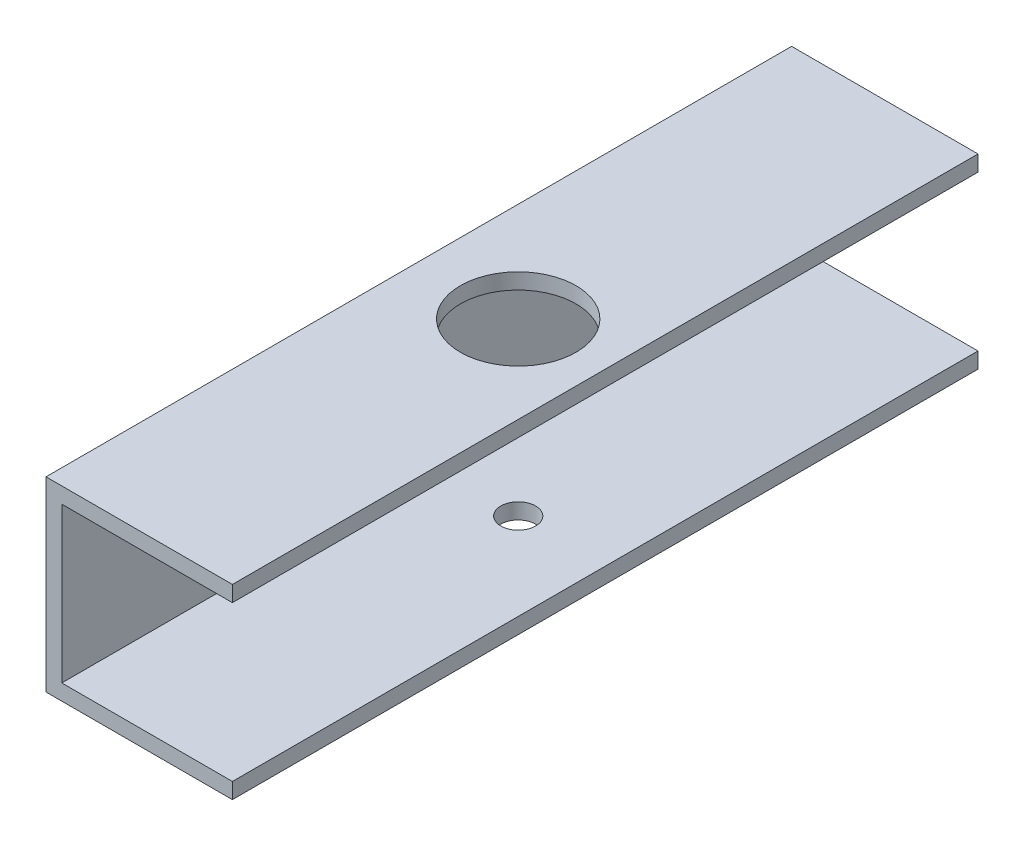
ISO-10303-21;
HEADER;
FILE_DESCRIPTION(('STEP AP214'),'2;1');
FILE_NAME('part.step','',(''),(''),'','','');
FILE_SCHEMA(('AUTOMOTIVE_DESIGN { 1 0 10303 214 1 1 1 1 }'));
ENDSEC;
DATA;
#1=APPLICATION_CONTEXT('core data for automotive mechanical design processes');
#2=APPLICATION_PROTOCOL_DEFINITION('international standard','automotive_design',2000,#1);
#3=PRODUCT_CONTEXT('',#1,'mechanical');
#4=PRODUCT('Part','Part','',(#3));
#5=PRODUCT_RELATED_PRODUCT_CATEGORY('part','',(#4));
#6=PRODUCT_DEFINITION_FORMATION('','',#4);
#7=PRODUCT_DEFINITION_CONTEXT('part definition',#1,'design');
#8=PRODUCT_DEFINITION('design','',#6,#7);
#9=PRODUCT_DEFINITION_SHAPE('','',#8);
#10=(LENGTH_UNIT() NAMED_UNIT(*) SI_UNIT(.MILLI.,.METRE.));
#11=(NAMED_UNIT(*) PLANE_ANGLE_UNIT() SI_UNIT($,.RADIAN.));
#12=(NAMED_UNIT(*) SI_UNIT($,.STERADIAN.) SOLID_ANGLE_UNIT());
#13=UNCERTAINTY_MEASURE_WITH_UNIT(LENGTH_MEASURE(1.E-05),#10,'distance_accuracy_value','');
#14=(GEOMETRIC_REPRESENTATION_CONTEXT(3) GLOBAL_UNCERTAINTY_ASSIGNED_CONTEXT((#13)) GLOBAL_UNIT_ASSIGNED_CONTEXT((#10,
#11,#12)) REPRESENTATION_CONTEXT('',''));
#15=CARTESIAN_POINT('',(0.,0.,0.));
#16=DIRECTION('',(0.,0.,1.));
#17=DIRECTION('',(1.,0.,0.));
#18=AXIS2_PLACEMENT_3D('',#15,#16,#17);
#19=CARTESIAN_POINT('',(75.,-37.5,300.));
#20=DIRECTION('',(0.,1.,0.));
#21=DIRECTION('',(0.,0.,1.));
#22=AXIS2_PLACEMENT_3D('',#19,#20,#21);
#23=PLANE('',#22);
#24=CARTESIAN_POINT('',(40.,-37.5,150.));
#25=DIRECTION('',(0.,-1.,0.));
#26=DIRECTION('',(0.,0.,-1.));
#27=AXIS2_PLACEMENT_3D('',#24,#25,#26);
#28=CIRCLE('',#27,7.);
#29=CARTESIAN_POINT('',(40.,-37.5,143.));
#30=VERTEX_POINT('',#29);
#31=EDGE_CURVE('E186',#30,#30,#28,.T.);
#32=ORIENTED_EDGE('',*,*,#31,.F.);
#33=EDGE_LOOP('',(#32));
#34=FACE_BOUND('',#33,.T.);
#35=DIRECTION('',(1.,0.,0.));
#36=VECTOR('',#35,1.);
#37=CARTESIAN_POINT('',(75.,-37.5,0.));
#38=LINE('',#37,#36);
#39=CARTESIAN_POINT('',(0.,-37.5,0.));
#40=VERTEX_POINT('',#39);
#41=CARTESIAN_POINT('',(75.,-37.5,0.));
#42=VERTEX_POINT('',#41);
#43=EDGE_CURVE('E132',#40,#42,#38,.T.);
#44=ORIENTED_EDGE('',*,*,#43,.T.);
#45=DIRECTION('',(0.,0.,-1.));
#46=VECTOR('',#45,1.);
#47=CARTESIAN_POINT('',(75.,-37.5,300.));
#48=LINE('',#47,#46);
#49=CARTESIAN_POINT('',(75.,-37.5,300.));
#50=VERTEX_POINT('',#49);
#51=EDGE_CURVE('E11',#50,#42,#48,.T.);
#52=ORIENTED_EDGE('',*,*,#51,.F.);
#53=DIRECTION('',(1.,0.,0.));
#54=VECTOR('',#53,1.);
#55=CARTESIAN_POINT('',(75.,-37.5,300.));
#56=LINE('',#55,#54);
#57=CARTESIAN_POINT('',(0.,-37.5,300.));
#58=VERTEX_POINT('',#57);
#59=EDGE_CURVE('E147',#58,#50,#56,.T.);
#60=ORIENTED_EDGE('',*,*,#59,.F.);
#61=DIRECTION('',(0.,0.,-1.));
#62=VECTOR('',#61,1.);
#63=CARTESIAN_POINT('',(0.,-37.5,300.));
#64=LINE('',#63,#62);
#65=EDGE_CURVE('E128',#58,#40,#64,.T.);
#66=ORIENTED_EDGE('',*,*,#65,.T.);
#67=EDGE_LOOP('',(#44,#52,#60,#66));
#68=FACE_BOUND('',#67,.T.);
#69=ADVANCED_FACE('F35',(#34,#68),#23,.F.);
#70=CARTESIAN_POINT('',(75.,-31.15,300.));
#71=DIRECTION('',(-1.,0.,0.));
#72=DIRECTION('',(0.,-1.,0.));
#73=AXIS2_PLACEMENT_3D('',#70,#71,#72);
#74=PLANE('',#73);
#75=DIRECTION('',(0.,1.,0.));
#76=VECTOR('',#75,1.);
#77=CARTESIAN_POINT('',(75.,-31.15,0.));
#78=LINE('',#77,#76);
#79=CARTESIAN_POINT('',(75.,-31.15,0.));
#80=VERTEX_POINT('',#79);
#81=EDGE_CURVE('E135',#42,#80,#78,.T.);
#82=ORIENTED_EDGE('',*,*,#81,.T.);
#83=DIRECTION('',(0.,0.,-1.));
#84=VECTOR('',#83,1.);
#85=CARTESIAN_POINT('',(75.,-31.15,300.));
#86=LINE('',#85,#84);
#87=CARTESIAN_POINT('',(75.,-31.15,300.));
#88=VERTEX_POINT('',#87);
#89=EDGE_CURVE('E44',#88,#80,#86,.T.);
#90=ORIENTED_EDGE('',*,*,#89,.F.);
#91=DIRECTION('',(0.,1.,0.));
#92=VECTOR('',#91,1.);
#93=CARTESIAN_POINT('',(75.,-31.15,300.));
#94=LINE('',#93,#92);
#95=EDGE_CURVE('E95',#50,#88,#94,.T.);
#96=ORIENTED_EDGE('',*,*,#95,.F.);
#97=ORIENTED_EDGE('',*,*,#51,.T.);
#98=EDGE_LOOP('',(#82,#90,#96,#97));
#99=FACE_BOUND('',#98,.T.);
#100=ADVANCED_FACE('F204',(#99),#74,.F.);
#101=CARTESIAN_POINT('',(6.35000000000001,-31.15,300.));
#102=DIRECTION('',(0.,-1.,0.));
#103=DIRECTION('',(0.,0.,-1.));
#104=AXIS2_PLACEMENT_3D('',#101,#102,#103);
#105=PLANE('',#104);
#106=CARTESIAN_POINT('',(40.,-31.15,150.));
#107=DIRECTION('',(0.,-1.,0.));
#108=DIRECTION('',(0.,0.,-1.));
#109=AXIS2_PLACEMENT_3D('',#106,#107,#108);
#110=CIRCLE('',#109,7.);
#111=CARTESIAN_POINT('',(40.,-31.15,143.));
#112=VERTEX_POINT('',#111);
#113=EDGE_CURVE('E38',#112,#112,#110,.T.);
#114=ORIENTED_EDGE('',*,*,#113,.T.);
#115=EDGE_LOOP('',(#114));
#116=FACE_BOUND('',#115,.T.);
#117=DIRECTION('',(-1.,0.,0.));
#118=VECTOR('',#117,1.);
#119=CARTESIAN_POINT('',(6.35000000000001,-31.15,0.));
#120=LINE('',#119,#118);
#121=CARTESIAN_POINT('',(6.35000000000001,-31.15,0.));
#122=VERTEX_POINT('',#121);
#123=EDGE_CURVE('E138',#80,#122,#120,.T.);
#124=ORIENTED_EDGE('',*,*,#123,.T.);
#125=DIRECTION('',(0.,0.,-1.));
#126=VECTOR('',#125,1.);
#127=CARTESIAN_POINT('',(6.35000000000001,-31.15,300.));
#128=LINE('',#127,#126);
#129=CARTESIAN_POINT('',(6.35000000000001,-31.15,300.));
#130=VERTEX_POINT('',#129);
#131=EDGE_CURVE('E154',#130,#122,#128,.T.);
#132=ORIENTED_EDGE('',*,*,#131,.F.);
#133=DIRECTION('',(-1.,0.,0.));
#134=VECTOR('',#133,1.);
#135=CARTESIAN_POINT('',(6.35000000000001,-31.15,300.));
#136=LINE('',#135,#134);
#137=EDGE_CURVE('E163',#88,#130,#136,.T.);
#138=ORIENTED_EDGE('',*,*,#137,.F.);
#139=ORIENTED_EDGE('',*,*,#89,.T.);
#140=EDGE_LOOP('',(#124,#132,#138,#139));
#141=FACE_BOUND('',#140,.T.);
#142=ADVANCED_FACE('F161',(#116,#141),#105,.F.);
#143=CARTESIAN_POINT('',(6.35000000000001,31.15,300.));
#144=DIRECTION('',(-1.,0.,0.));
#145=DIRECTION('',(0.,0.,1.));
#146=AXIS2_PLACEMENT_3D('',#143,#144,#145);
#147=PLANE('',#146);
#148=DIRECTION('',(0.,1.,0.));
#149=VECTOR('',#148,1.);
#150=CARTESIAN_POINT('',(6.35000000000001,31.15,0.));
#151=LINE('',#150,#149);
#152=CARTESIAN_POINT('',(6.35000000000001,31.15,0.));
#153=VERTEX_POINT('',#152);
#154=EDGE_CURVE('E140',#122,#153,#151,.T.);
#155=ORIENTED_EDGE('',*,*,#154,.T.);
#156=DIRECTION('',(0.,0.,-1.));
#157=VECTOR('',#156,1.);
#158=CARTESIAN_POINT('',(6.35000000000001,31.15,300.));
#159=LINE('',#158,#157);
#160=CARTESIAN_POINT('',(6.35000000000001,31.15,300.));
#161=VERTEX_POINT('',#160);
#162=EDGE_CURVE('E151',#161,#153,#159,.T.);
#163=ORIENTED_EDGE('',*,*,#162,.F.);
#164=DIRECTION('',(0.,1.,0.));
#165=VECTOR('',#164,1.);
#166=CARTESIAN_POINT('',(6.35000000000001,31.15,300.));
#167=LINE('',#166,#165);
#168=EDGE_CURVE('E175',#130,#161,#167,.T.);
#169=ORIENTED_EDGE('',*,*,#168,.F.);
#170=ORIENTED_EDGE('',*,*,#131,.T.);
#171=EDGE_LOOP('',(#155,#163,#169,#170));
#172=FACE_BOUND('',#171,.T.);
#173=ADVANCED_FACE('F171',(#172),#147,.F.);
#174=CARTESIAN_POINT('',(75.,31.15,300.));
#175=DIRECTION('',(0.,1.,0.));
#176=DIRECTION('',(0.,0.,1.));
#177=AXIS2_PLACEMENT_3D('',#174,#175,#176);
#178=PLANE('',#177);
#179=CARTESIAN_POINT('',(40.,31.15,150.));
#180=DIRECTION('',(0.,1.,0.));
#181=DIRECTION('',(0.,0.,1.));
#182=AXIS2_PLACEMENT_3D('',#179,#180,#181);
#183=CIRCLE('',#182,23.25);
#184=CARTESIAN_POINT('',(40.,31.15,173.25));
#185=VERTEX_POINT('',#184);
#186=EDGE_CURVE('E136',#185,#185,#183,.T.);
#187=ORIENTED_EDGE('',*,*,#186,.T.);
#188=EDGE_LOOP('',(#187));
#189=FACE_BOUND('',#188,.T.);
#190=DIRECTION('',(1.,0.,0.));
#191=VECTOR('',#190,1.);
#192=CARTESIAN_POINT('',(75.,31.15,0.));
#193=LINE('',#192,#191);
#194=CARTESIAN_POINT('',(75.,31.15,0.));
#195=VERTEX_POINT('',#194);
#196=EDGE_CURVE('E142',#153,#195,#193,.T.);
#197=ORIENTED_EDGE('',*,*,#196,.T.);
#198=DIRECTION('',(0.,0.,-1.));
#199=VECTOR('',#198,1.);
#200=CARTESIAN_POINT('',(75.,31.15,300.));
#201=LINE('',#200,#199);
#202=CARTESIAN_POINT('',(75.,31.15,300.));
#203=VERTEX_POINT('',#202);
#204=EDGE_CURVE('E123',#203,#195,#201,.T.);
#205=ORIENTED_EDGE('',*,*,#204,.F.);
#206=DIRECTION('',(1.,0.,0.));
#207=VECTOR('',#206,1.);
#208=CARTESIAN_POINT('',(75.,31.15,300.));
#209=LINE('',#208,#207);
#210=EDGE_CURVE('E114',#161,#203,#209,.T.);
#211=ORIENTED_EDGE('',*,*,#210,.F.);
#212=ORIENTED_EDGE('',*,*,#162,.T.);
#213=EDGE_LOOP('',(#197,#205,#211,#212));
#214=FACE_BOUND('',#213,.T.);
#215=ADVANCED_FACE('F174',(#189,#214),#178,.F.);
#216=CARTESIAN_POINT('',(75.,37.5,300.));
#217=DIRECTION('',(-1.,0.,0.));
#218=DIRECTION('',(0.,-1.,0.));
#219=AXIS2_PLACEMENT_3D('',#216,#217,#218);
#220=PLANE('',#219);
#221=DIRECTION('',(0.,1.,0.));
#222=VECTOR('',#221,1.);
#223=CARTESIAN_POINT('',(75.,37.5,0.));
#224=LINE('',#223,#222);
#225=CARTESIAN_POINT('',(75.,37.5,0.));
#226=VERTEX_POINT('',#225);
#227=EDGE_CURVE('E122',#195,#226,#224,.T.);
#228=ORIENTED_EDGE('',*,*,#227,.T.);
#229=DIRECTION('',(0.,0.,-1.));
#230=VECTOR('',#229,1.);
#231=CARTESIAN_POINT('',(75.,37.5,300.));
#232=LINE('',#231,#230);
#233=CARTESIAN_POINT('',(75.,37.5,300.));
#234=VERTEX_POINT('',#233);
#235=EDGE_CURVE('E119',#234,#226,#232,.T.);
#236=ORIENTED_EDGE('',*,*,#235,.F.);
#237=DIRECTION('',(0.,1.,0.));
#238=VECTOR('',#237,1.);
#239=CARTESIAN_POINT('',(75.,37.5,300.));
#240=LINE('',#239,#238);
#241=EDGE_CURVE('E108',#203,#234,#240,.T.);
#242=ORIENTED_EDGE('',*,*,#241,.F.);
#243=ORIENTED_EDGE('',*,*,#204,.T.);
#244=EDGE_LOOP('',(#228,#236,#242,#243));
#245=FACE_BOUND('',#244,.T.);
#246=ADVANCED_FACE('F120',(#245),#220,.F.);
#247=CARTESIAN_POINT('',(0.,37.5,300.));
#248=DIRECTION('',(0.,-1.,0.));
#249=DIRECTION('',(0.,0.,-1.));
#250=AXIS2_PLACEMENT_3D('',#247,#248,#249);
#251=PLANE('',#250);
#252=CARTESIAN_POINT('',(40.,37.5,150.));
#253=DIRECTION('',(0.,1.,0.));
#254=DIRECTION('',(0.,0.,1.));
#255=AXIS2_PLACEMENT_3D('',#252,#253,#254);
#256=CIRCLE('',#255,23.25);
#257=CARTESIAN_POINT('',(40.,37.5,173.25));
#258=VERTEX_POINT('',#257);
#259=EDGE_CURVE('E183',#258,#258,#256,.T.);
#260=ORIENTED_EDGE('',*,*,#259,.F.);
#261=EDGE_LOOP('',(#260));
#262=FACE_BOUND('',#261,.T.);
#263=DIRECTION('',(-1.,0.,0.));
#264=VECTOR('',#263,1.);
#265=CARTESIAN_POINT('',(0.,37.5,0.));
#266=LINE('',#265,#264);
#267=CARTESIAN_POINT('',(0.,37.5,0.));
#268=VERTEX_POINT('',#267);
#269=EDGE_CURVE('E81',#226,#268,#266,.T.);
#270=ORIENTED_EDGE('',*,*,#269,.T.);
#271=DIRECTION('',(0.,0.,-1.));
#272=VECTOR('',#271,1.);
#273=CARTESIAN_POINT('',(0.,37.5,300.));
#274=LINE('',#273,#272);
#275=CARTESIAN_POINT('',(0.,37.5,300.));
#276=VERTEX_POINT('',#275);
#277=EDGE_CURVE('E124',#276,#268,#274,.T.);
#278=ORIENTED_EDGE('',*,*,#277,.F.);
#279=DIRECTION('',(-1.,0.,0.));
#280=VECTOR('',#279,1.);
#281=CARTESIAN_POINT('',(0.,37.5,300.));
#282=LINE('',#281,#280);
#283=EDGE_CURVE('E112',#234,#276,#282,.T.);
#284=ORIENTED_EDGE('',*,*,#283,.F.);
#285=ORIENTED_EDGE('',*,*,#235,.T.);
#286=EDGE_LOOP('',(#270,#278,#284,#285));
#287=FACE_BOUND('',#286,.T.);
#288=ADVANCED_FACE('F126',(#262,#287),#251,.F.);
#289=CARTESIAN_POINT('',(0.,-37.5,300.));
#290=DIRECTION('',(1.,0.,0.));
#291=DIRECTION('',(0.,0.,-1.));
#292=AXIS2_PLACEMENT_3D('',#289,#290,#291);
#293=PLANE('',#292);
#294=DIRECTION('',(0.,-1.,0.));
#295=VECTOR('',#294,1.);
#296=CARTESIAN_POINT('',(0.,-37.5,0.));
#297=LINE('',#296,#295);
#298=EDGE_CURVE('E87',#268,#40,#297,.T.);
#299=ORIENTED_EDGE('',*,*,#298,.T.);
#300=ORIENTED_EDGE('',*,*,#65,.F.);
#301=DIRECTION('',(0.,-1.,0.));
#302=VECTOR('',#301,1.);
#303=CARTESIAN_POINT('',(0.,-37.5,300.));
#304=LINE('',#303,#302);
#305=EDGE_CURVE('E52',#276,#58,#304,.T.);
#306=ORIENTED_EDGE('',*,*,#305,.F.);
#307=ORIENTED_EDGE('',*,*,#277,.T.);
#308=EDGE_LOOP('',(#299,#300,#306,#307));
#309=FACE_BOUND('',#308,.T.);
#310=ADVANCED_FACE('F214',(#309),#293,.F.);
#311=CARTESIAN_POINT('',(0.,0.,300.));
#312=DIRECTION('',(0.,0.,-1.));
#313=DIRECTION('',(-1.,0.,0.));
#314=AXIS2_PLACEMENT_3D('',#311,#312,#313);
#315=PLANE('',#314);
#316=ORIENTED_EDGE('',*,*,#59,.T.);
#317=ORIENTED_EDGE('',*,*,#95,.T.);
#318=ORIENTED_EDGE('',*,*,#137,.T.);
#319=ORIENTED_EDGE('',*,*,#168,.T.);
#320=ORIENTED_EDGE('',*,*,#210,.T.);
#321=ORIENTED_EDGE('',*,*,#241,.T.);
#322=ORIENTED_EDGE('',*,*,#283,.T.);
#323=ORIENTED_EDGE('',*,*,#305,.T.);
#324=EDGE_LOOP('',(#316,#317,#318,#319,#320,#321,#322,#323));
#325=FACE_BOUND('',#324,.T.);
#326=ADVANCED_FACE('F110',(#325),#315,.F.);
#327=CARTESIAN_POINT('',(0.,0.,0.));
#328=DIRECTION('',(0.,0.,-1.));
#329=DIRECTION('',(-1.,0.,0.));
#330=AXIS2_PLACEMENT_3D('',#327,#328,#329);
#331=PLANE('',#330);
#332=ORIENTED_EDGE('',*,*,#43,.F.);
#333=ORIENTED_EDGE('',*,*,#298,.F.);
#334=ORIENTED_EDGE('',*,*,#269,.F.);
#335=ORIENTED_EDGE('',*,*,#227,.F.);
#336=ORIENTED_EDGE('',*,*,#196,.F.);
#337=ORIENTED_EDGE('',*,*,#154,.F.);
#338=ORIENTED_EDGE('',*,*,#123,.F.);
#339=ORIENTED_EDGE('',*,*,#81,.F.);
#340=EDGE_LOOP('',(#332,#333,#334,#335,#336,#337,#338,#339));
#341=FACE_BOUND('',#340,.T.);
#342=ADVANCED_FACE('F167',(#341),#331,.T.);
#343=CARTESIAN_POINT('',(40.,27.5,150.));
#344=DIRECTION('',(0.,1.,0.));
#345=DIRECTION('',(0.,0.,1.));
#346=AXIS2_PLACEMENT_3D('',#343,#344,#345);
#347=CYLINDRICAL_SURFACE('',#346,23.25);
#348=ORIENTED_EDGE('',*,*,#259,.T.);
#349=EDGE_LOOP('',(#348));
#350=FACE_BOUND('',#349,.T.);
#351=ORIENTED_EDGE('',*,*,#186,.F.);
#352=EDGE_LOOP('',(#351));
#353=FACE_BOUND('',#352,.T.);
#354=ADVANCED_FACE('F196',(#350,#353),#347,.F.);
#355=CARTESIAN_POINT('',(40.,-27.5,150.));
#356=DIRECTION('',(0.,-1.,0.));
#357=DIRECTION('',(0.,0.,-1.));
#358=AXIS2_PLACEMENT_3D('',#355,#356,#357);
#359=CYLINDRICAL_SURFACE('',#358,7.);
#360=ORIENTED_EDGE('',*,*,#31,.T.);
#361=EDGE_LOOP('',(#360));
#362=FACE_BOUND('',#361,.T.);
#363=ORIENTED_EDGE('',*,*,#113,.F.);
#364=EDGE_LOOP('',(#363));
#365=FACE_BOUND('',#364,.T.);
#366=ADVANCED_FACE('F194',(#362,#365),#359,.F.);
#367=CLOSED_SHELL('',(#69,#100,#142,#173,#215,#246,#288,#310,#326,#342,#354,#366));
#368=MANIFOLD_SOLID_BREP('B2',#367);
#369=ADVANCED_BREP_SHAPE_REPRESENTATION('',(#18,#368),#14);
#370=SHAPE_DEFINITION_REPRESENTATION(#9,#369);
ENDSEC;
END-ISO-10303-21;
